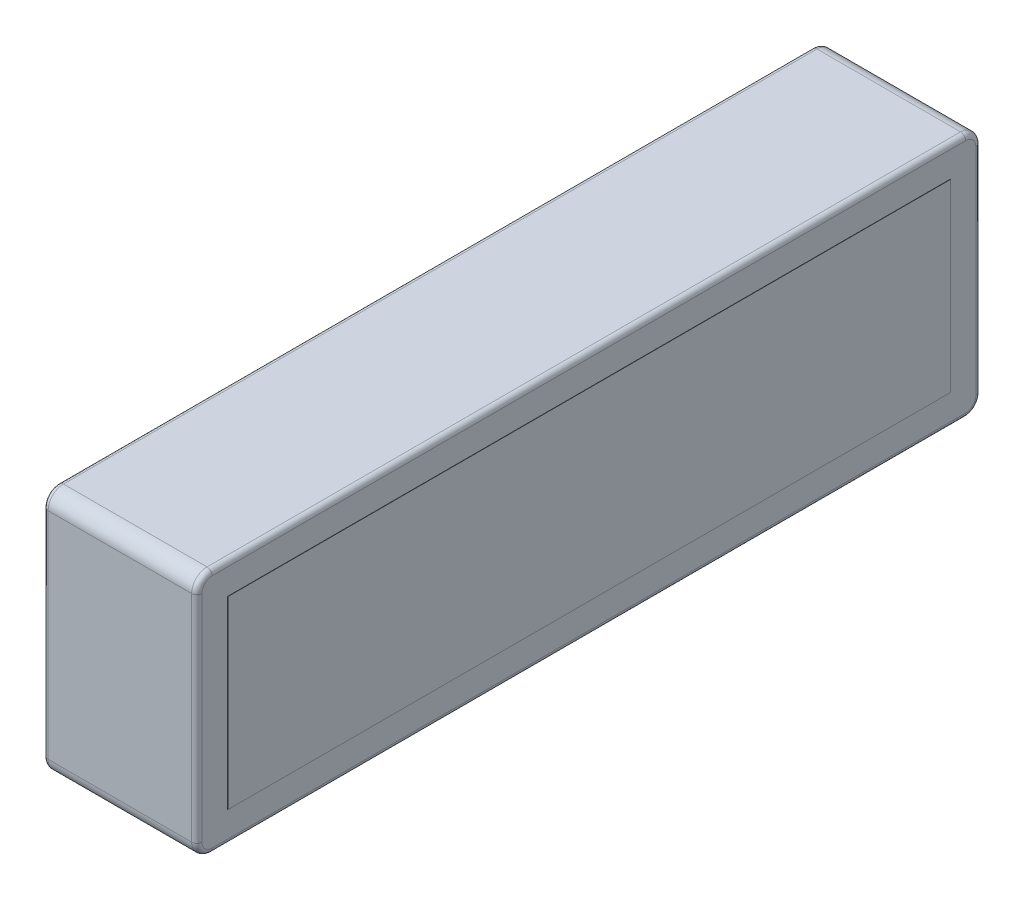
ISO-10303-21;
HEADER;
FILE_DESCRIPTION(('STEP AP214'),'2;1');
FILE_NAME('part.step','',(''),(''),'','','');
FILE_SCHEMA(('AUTOMOTIVE_DESIGN { 1 0 10303 214 1 1 1 1 }'));
ENDSEC;
DATA;
#1=APPLICATION_CONTEXT('core data for automotive mechanical design processes');
#2=APPLICATION_PROTOCOL_DEFINITION('international standard','automotive_design',2000,#1);
#3=PRODUCT_CONTEXT('',#1,'mechanical');
#4=PRODUCT('Part','Part','',(#3));
#5=PRODUCT_RELATED_PRODUCT_CATEGORY('part','',(#4));
#6=PRODUCT_DEFINITION_FORMATION('','',#4);
#7=PRODUCT_DEFINITION_CONTEXT('part definition',#1,'design');
#8=PRODUCT_DEFINITION('design','',#6,#7);
#9=PRODUCT_DEFINITION_SHAPE('','',#8);
#10=(LENGTH_UNIT() NAMED_UNIT(*) SI_UNIT(.MILLI.,.METRE.));
#11=(NAMED_UNIT(*) PLANE_ANGLE_UNIT() SI_UNIT($,.RADIAN.));
#12=(NAMED_UNIT(*) SI_UNIT($,.STERADIAN.) SOLID_ANGLE_UNIT());
#13=UNCERTAINTY_MEASURE_WITH_UNIT(LENGTH_MEASURE(1.E-05),#10,'distance_accuracy_value','');
#14=(GEOMETRIC_REPRESENTATION_CONTEXT(3) GLOBAL_UNCERTAINTY_ASSIGNED_CONTEXT((#13)) GLOBAL_UNIT_ASSIGNED_CONTEXT((#10,
#11,#12)) REPRESENTATION_CONTEXT('',''));
#15=CARTESIAN_POINT('',(0.,0.,0.));
#16=DIRECTION('',(0.,0.,1.));
#17=DIRECTION('',(1.,0.,0.));
#18=AXIS2_PLACEMENT_3D('',#15,#16,#17);
#19=CARTESIAN_POINT('',(-15.,24.,153.));
#20=DIRECTION('',(1.,0.,0.));
#21=DIRECTION('',(0.,1.,0.));
#22=AXIS2_PLACEMENT_3D('',#19,#20,#21);
#23=PLANE('',#22);
#24=DIRECTION('',(0.,-1.,0.));
#25=VECTOR('',#24,1.);
#26=CARTESIAN_POINT('',(-15.,24.,1.));
#27=LINE('',#26,#25);
#28=CARTESIAN_POINT('',(-15.,21.,1.));
#29=VERTEX_POINT('',#28);
#30=CARTESIAN_POINT('',(-15.,-21.,1.));
#31=VERTEX_POINT('',#30);
#32=EDGE_CURVE('E307',#29,#31,#27,.T.);
#33=ORIENTED_EDGE('',*,*,#32,.T.);
#34=CARTESIAN_POINT('',(-15.,-21.,3.));
#35=DIRECTION('',(1.,0.,0.));
#36=DIRECTION('',(0.,1.,0.));
#37=AXIS2_PLACEMENT_3D('',#34,#35,#36);
#38=CIRCLE('',#37,2.);
#39=CARTESIAN_POINT('',(-15.,-23.,3.));
#40=VERTEX_POINT('',#39);
#41=EDGE_CURVE('E309',#31,#40,#38,.F.);
#42=ORIENTED_EDGE('',*,*,#41,.T.);
#43=DIRECTION('',(0.,0.,-1.));
#44=VECTOR('',#43,1.);
#45=CARTESIAN_POINT('',(-15.,-23.,153.));
#46=LINE('',#45,#44);
#47=CARTESIAN_POINT('',(-15.,-23.,150.));
#48=VERTEX_POINT('',#47);
#49=EDGE_CURVE('E295',#40,#48,#46,.F.);
#50=ORIENTED_EDGE('',*,*,#49,.T.);
#51=CARTESIAN_POINT('',(-15.,-21.,150.));
#52=DIRECTION('',(1.,0.,0.));
#53=DIRECTION('',(0.,1.,0.));
#54=AXIS2_PLACEMENT_3D('',#51,#52,#53);
#55=CIRCLE('',#54,2.);
#56=CARTESIAN_POINT('',(-15.,-21.,152.));
#57=VERTEX_POINT('',#56);
#58=EDGE_CURVE('E297',#48,#57,#55,.F.);
#59=ORIENTED_EDGE('',*,*,#58,.T.);
#60=DIRECTION('',(0.,-1.,0.));
#61=VECTOR('',#60,1.);
#62=CARTESIAN_POINT('',(-15.,21.,152.));
#63=LINE('',#62,#61);
#64=CARTESIAN_POINT('',(-15.,21.,152.));
#65=VERTEX_POINT('',#64);
#66=EDGE_CURVE('E299',#57,#65,#63,.F.);
#67=ORIENTED_EDGE('',*,*,#66,.T.);
#68=CARTESIAN_POINT('',(-15.,21.,150.));
#69=DIRECTION('',(1.,0.,0.));
#70=DIRECTION('',(0.,1.,0.));
#71=AXIS2_PLACEMENT_3D('',#68,#69,#70);
#72=CIRCLE('',#71,2.);
#73=CARTESIAN_POINT('',(-15.,23.,150.));
#74=VERTEX_POINT('',#73);
#75=EDGE_CURVE('E301',#65,#74,#72,.F.);
#76=ORIENTED_EDGE('',*,*,#75,.T.);
#77=DIRECTION('',(0.,0.,-1.));
#78=VECTOR('',#77,1.);
#79=CARTESIAN_POINT('',(-15.,23.,153.));
#80=LINE('',#79,#78);
#81=CARTESIAN_POINT('',(-15.,23.,3.));
#82=VERTEX_POINT('',#81);
#83=EDGE_CURVE('E303',#74,#82,#80,.T.);
#84=ORIENTED_EDGE('',*,*,#83,.T.);
#85=CARTESIAN_POINT('',(-15.,21.,3.));
#86=DIRECTION('',(1.,0.,0.));
#87=DIRECTION('',(0.,1.,0.));
#88=AXIS2_PLACEMENT_3D('',#85,#86,#87);
#89=CIRCLE('',#88,2.);
#90=EDGE_CURVE('E305',#82,#29,#89,.F.);
#91=ORIENTED_EDGE('',*,*,#90,.T.);
#92=EDGE_LOOP('',(#33,#42,#50,#59,#67,#76,#84,#91));
#93=FACE_BOUND('',#92,.T.);
#94=DIRECTION('',(0.,0.,-1.));
#95=VECTOR('',#94,1.);
#96=CARTESIAN_POINT('',(-15.,18.,147.));
#97=LINE('',#96,#95);
#98=CARTESIAN_POINT('',(-15.,18.,147.));
#99=VERTEX_POINT('',#98);
#100=CARTESIAN_POINT('',(-15.,18.,6.00000000000001));
#101=VERTEX_POINT('',#100);
#102=EDGE_CURVE('E210',#99,#101,#97,.T.);
#103=ORIENTED_EDGE('',*,*,#102,.F.);
#104=DIRECTION('',(0.,1.,0.));
#105=VECTOR('',#104,1.);
#106=CARTESIAN_POINT('',(-15.,-18.,147.));
#107=LINE('',#106,#105);
#108=CARTESIAN_POINT('',(-15.,-18.,147.));
#109=VERTEX_POINT('',#108);
#110=EDGE_CURVE('E244',#109,#99,#107,.T.);
#111=ORIENTED_EDGE('',*,*,#110,.F.);
#112=DIRECTION('',(0.,0.,1.));
#113=VECTOR('',#112,1.);
#114=CARTESIAN_POINT('',(-15.,-18.,6.));
#115=LINE('',#114,#113);
#116=CARTESIAN_POINT('',(-15.,-18.,6.00000000000001));
#117=VERTEX_POINT('',#116);
#118=EDGE_CURVE('E254',#117,#109,#115,.T.);
#119=ORIENTED_EDGE('',*,*,#118,.F.);
#120=DIRECTION('',(0.,-1.,0.));
#121=VECTOR('',#120,1.);
#122=CARTESIAN_POINT('',(-15.,18.,6.));
#123=LINE('',#122,#121);
#124=EDGE_CURVE('E61',#101,#117,#123,.T.);
#125=ORIENTED_EDGE('',*,*,#124,.F.);
#126=EDGE_LOOP('',(#103,#111,#119,#125));
#127=FACE_BOUND('',#126,.T.);
#128=ADVANCED_FACE('F36',(#93,#127),#23,.F.);
#129=CARTESIAN_POINT('',(15.,24.,153.));
#130=DIRECTION('',(-1.,0.,0.));
#131=DIRECTION('',(0.,-1.,0.));
#132=AXIS2_PLACEMENT_3D('',#129,#130,#131);
#133=PLANE('',#132);
#134=DIRECTION('',(0.,1.,0.));
#135=VECTOR('',#134,1.);
#136=CARTESIAN_POINT('',(15.,-18.,147.));
#137=LINE('',#136,#135);
#138=CARTESIAN_POINT('',(15.,-18.,147.));
#139=VERTEX_POINT('',#138);
#140=CARTESIAN_POINT('',(15.,18.,147.));
#141=VERTEX_POINT('',#140);
#142=EDGE_CURVE('E231',#139,#141,#137,.T.);
#143=ORIENTED_EDGE('',*,*,#142,.T.);
#144=DIRECTION('',(0.,0.,-1.));
#145=VECTOR('',#144,1.);
#146=CARTESIAN_POINT('',(15.,18.,147.));
#147=LINE('',#146,#145);
#148=CARTESIAN_POINT('',(15.,18.,6.));
#149=VERTEX_POINT('',#148);
#150=EDGE_CURVE('E205',#141,#149,#147,.T.);
#151=ORIENTED_EDGE('',*,*,#150,.T.);
#152=DIRECTION('',(0.,-1.,0.));
#153=VECTOR('',#152,1.);
#154=CARTESIAN_POINT('',(15.,18.,6.));
#155=LINE('',#154,#153);
#156=CARTESIAN_POINT('',(15.,-18.,6.));
#157=VERTEX_POINT('',#156);
#158=EDGE_CURVE('E221',#149,#157,#155,.T.);
#159=ORIENTED_EDGE('',*,*,#158,.T.);
#160=DIRECTION('',(0.,0.,1.));
#161=VECTOR('',#160,1.);
#162=CARTESIAN_POINT('',(15.,-18.,6.));
#163=LINE('',#162,#161);
#164=EDGE_CURVE('E53',#157,#139,#163,.T.);
#165=ORIENTED_EDGE('',*,*,#164,.T.);
#166=EDGE_LOOP('',(#143,#151,#159,#165));
#167=FACE_BOUND('',#166,.T.);
#168=DIRECTION('',(0.,0.,-1.));
#169=VECTOR('',#168,1.);
#170=CARTESIAN_POINT('',(15.,23.,153.));
#171=LINE('',#170,#169);
#172=CARTESIAN_POINT('',(15.,23.,3.));
#173=VERTEX_POINT('',#172);
#174=CARTESIAN_POINT('',(15.,23.,150.));
#175=VERTEX_POINT('',#174);
#176=EDGE_CURVE('E45',#173,#175,#171,.F.);
#177=ORIENTED_EDGE('',*,*,#176,.T.);
#178=CARTESIAN_POINT('',(15.,21.,150.));
#179=DIRECTION('',(-1.,0.,0.));
#180=DIRECTION('',(0.,-1.,0.));
#181=AXIS2_PLACEMENT_3D('',#178,#179,#180);
#182=CIRCLE('',#181,2.);
#183=CARTESIAN_POINT('',(15.,21.,152.));
#184=VERTEX_POINT('',#183);
#185=EDGE_CURVE('E11',#175,#184,#182,.F.);
#186=ORIENTED_EDGE('',*,*,#185,.T.);
#187=DIRECTION('',(0.,1.,0.));
#188=VECTOR('',#187,1.);
#189=CARTESIAN_POINT('',(15.,-21.,152.));
#190=LINE('',#189,#188);
#191=CARTESIAN_POINT('',(15.,-21.,152.));
#192=VERTEX_POINT('',#191);
#193=EDGE_CURVE('E346',#184,#192,#190,.F.);
#194=ORIENTED_EDGE('',*,*,#193,.T.);
#195=CARTESIAN_POINT('',(15.,-21.,150.));
#196=DIRECTION('',(-1.,0.,0.));
#197=DIRECTION('',(0.,-1.,0.));
#198=AXIS2_PLACEMENT_3D('',#195,#196,#197);
#199=CIRCLE('',#198,2.);
#200=CARTESIAN_POINT('',(15.,-23.,150.));
#201=VERTEX_POINT('',#200);
#202=EDGE_CURVE('E348',#192,#201,#199,.F.);
#203=ORIENTED_EDGE('',*,*,#202,.T.);
#204=DIRECTION('',(0.,0.,-1.));
#205=VECTOR('',#204,1.);
#206=CARTESIAN_POINT('',(15.,-23.,153.));
#207=LINE('',#206,#205);
#208=CARTESIAN_POINT('',(15.,-23.,3.));
#209=VERTEX_POINT('',#208);
#210=EDGE_CURVE('E350',#201,#209,#207,.T.);
#211=ORIENTED_EDGE('',*,*,#210,.T.);
#212=CARTESIAN_POINT('',(15.,-21.,3.));
#213=DIRECTION('',(-1.,0.,0.));
#214=DIRECTION('',(0.,-1.,0.));
#215=AXIS2_PLACEMENT_3D('',#212,#213,#214);
#216=CIRCLE('',#215,2.);
#217=CARTESIAN_POINT('',(15.,-21.,1.));
#218=VERTEX_POINT('',#217);
#219=EDGE_CURVE('E352',#209,#218,#216,.F.);
#220=ORIENTED_EDGE('',*,*,#219,.T.);
#221=DIRECTION('',(0.,1.,0.));
#222=VECTOR('',#221,1.);
#223=CARTESIAN_POINT('',(15.,24.,1.));
#224=LINE('',#223,#222);
#225=CARTESIAN_POINT('',(15.,21.,1.));
#226=VERTEX_POINT('',#225);
#227=EDGE_CURVE('E354',#218,#226,#224,.T.);
#228=ORIENTED_EDGE('',*,*,#227,.T.);
#229=CARTESIAN_POINT('',(15.,21.,3.));
#230=DIRECTION('',(-1.,0.,0.));
#231=DIRECTION('',(0.,-1.,0.));
#232=AXIS2_PLACEMENT_3D('',#229,#230,#231);
#233=CIRCLE('',#232,2.);
#234=EDGE_CURVE('E356',#226,#173,#233,.F.);
#235=ORIENTED_EDGE('',*,*,#234,.T.);
#236=EDGE_LOOP('',(#177,#186,#194,#203,#211,#220,#228,#235));
#237=FACE_BOUND('',#236,.T.);
#238=ADVANCED_FACE('F498',(#167,#237),#133,.F.);
#239=CARTESIAN_POINT('',(-15.,24.,153.));
#240=DIRECTION('',(0.,-1.,0.));
#241=DIRECTION('',(0.,0.,-1.));
#242=AXIS2_PLACEMENT_3D('',#239,#240,#241);
#243=PLANE('',#242);
#244=DIRECTION('',(-1.,0.,0.));
#245=VECTOR('',#244,1.);
#246=CARTESIAN_POINT('',(-15.,24.,3.));
#247=LINE('',#246,#245);
#248=CARTESIAN_POINT('',(14.,24.,3.));
#249=VERTEX_POINT('',#248);
#250=CARTESIAN_POINT('',(-14.,24.,3.));
#251=VERTEX_POINT('',#250);
#252=EDGE_CURVE('E292',#249,#251,#247,.T.);
#253=ORIENTED_EDGE('',*,*,#252,.T.);
#254=DIRECTION('',(0.,0.,-1.));
#255=VECTOR('',#254,1.);
#256=CARTESIAN_POINT('',(-14.,24.,153.));
#257=LINE('',#256,#255);
#258=CARTESIAN_POINT('',(-14.,24.,150.));
#259=VERTEX_POINT('',#258);
#260=EDGE_CURVE('E327',#251,#259,#257,.F.);
#261=ORIENTED_EDGE('',*,*,#260,.T.);
#262=DIRECTION('',(-1.,0.,0.));
#263=VECTOR('',#262,1.);
#264=CARTESIAN_POINT('',(15.,24.,150.));
#265=LINE('',#264,#263);
#266=CARTESIAN_POINT('',(14.,24.,150.));
#267=VERTEX_POINT('',#266);
#268=EDGE_CURVE('E289',#259,#267,#265,.F.);
#269=ORIENTED_EDGE('',*,*,#268,.T.);
#270=DIRECTION('',(0.,0.,-1.));
#271=VECTOR('',#270,1.);
#272=CARTESIAN_POINT('',(14.,24.,153.));
#273=LINE('',#272,#271);
#274=EDGE_CURVE('E325',#267,#249,#273,.T.);
#275=ORIENTED_EDGE('',*,*,#274,.T.);
#276=EDGE_LOOP('',(#253,#261,#269,#275));
#277=FACE_BOUND('',#276,.T.);
#278=ADVANCED_FACE('F454',(#277),#243,.F.);
#279=CARTESIAN_POINT('',(-15.,-24.,153.));
#280=DIRECTION('',(0.,1.,0.));
#281=DIRECTION('',(0.,0.,1.));
#282=AXIS2_PLACEMENT_3D('',#279,#280,#281);
#283=PLANE('',#282);
#284=DIRECTION('',(1.,0.,0.));
#285=VECTOR('',#284,1.);
#286=CARTESIAN_POINT('',(-15.,-24.,150.));
#287=LINE('',#286,#285);
#288=CARTESIAN_POINT('',(14.,-24.,150.));
#289=VERTEX_POINT('',#288);
#290=CARTESIAN_POINT('',(-14.,-24.,150.));
#291=VERTEX_POINT('',#290);
#292=EDGE_CURVE('E280',#289,#291,#287,.F.);
#293=ORIENTED_EDGE('',*,*,#292,.T.);
#294=DIRECTION('',(0.,0.,-1.));
#295=VECTOR('',#294,1.);
#296=CARTESIAN_POINT('',(-14.,-24.,153.));
#297=LINE('',#296,#295);
#298=CARTESIAN_POINT('',(-14.,-24.,3.));
#299=VERTEX_POINT('',#298);
#300=EDGE_CURVE('E344',#291,#299,#297,.T.);
#301=ORIENTED_EDGE('',*,*,#300,.T.);
#302=DIRECTION('',(1.,0.,0.));
#303=VECTOR('',#302,1.);
#304=CARTESIAN_POINT('',(-15.,-24.,3.));
#305=LINE('',#304,#303);
#306=CARTESIAN_POINT('',(14.,-24.,3.));
#307=VERTEX_POINT('',#306);
#308=EDGE_CURVE('E277',#299,#307,#305,.T.);
#309=ORIENTED_EDGE('',*,*,#308,.T.);
#310=DIRECTION('',(0.,0.,-1.));
#311=VECTOR('',#310,1.);
#312=CARTESIAN_POINT('',(14.,-24.,153.));
#313=LINE('',#312,#311);
#314=EDGE_CURVE('E342',#307,#289,#313,.F.);
#315=ORIENTED_EDGE('',*,*,#314,.T.);
#316=EDGE_LOOP('',(#293,#301,#309,#315));
#317=FACE_BOUND('',#316,.T.);
#318=ADVANCED_FACE('F416',(#317),#283,.F.);
#319=CARTESIAN_POINT('',(0.,0.,153.));
#320=DIRECTION('',(0.,0.,1.));
#321=DIRECTION('',(1.,0.,0.));
#322=AXIS2_PLACEMENT_3D('',#319,#320,#321);
#323=PLANE('',#322);
#324=DIRECTION('',(-1.,0.,0.));
#325=VECTOR('',#324,1.);
#326=CARTESIAN_POINT('',(-15.,21.,153.));
#327=LINE('',#326,#325);
#328=CARTESIAN_POINT('',(14.,21.,153.));
#329=VERTEX_POINT('',#328);
#330=CARTESIAN_POINT('',(-14.,21.,153.));
#331=VERTEX_POINT('',#330);
#332=EDGE_CURVE('E270',#329,#331,#327,.T.);
#333=ORIENTED_EDGE('',*,*,#332,.T.);
#334=DIRECTION('',(0.,-1.,0.));
#335=VECTOR('',#334,1.);
#336=CARTESIAN_POINT('',(-14.,-21.,153.));
#337=LINE('',#336,#335);
#338=CARTESIAN_POINT('',(-14.,-21.,153.));
#339=VERTEX_POINT('',#338);
#340=EDGE_CURVE('E336',#331,#339,#337,.T.);
#341=ORIENTED_EDGE('',*,*,#340,.T.);
#342=DIRECTION('',(1.,0.,0.));
#343=VECTOR('',#342,1.);
#344=CARTESIAN_POINT('',(15.,-21.,153.));
#345=LINE('',#344,#343);
#346=CARTESIAN_POINT('',(14.,-21.,153.));
#347=VERTEX_POINT('',#346);
#348=EDGE_CURVE('E273',#339,#347,#345,.T.);
#349=ORIENTED_EDGE('',*,*,#348,.T.);
#350=DIRECTION('',(0.,1.,0.));
#351=VECTOR('',#350,1.);
#352=CARTESIAN_POINT('',(14.,21.,153.));
#353=LINE('',#352,#351);
#354=EDGE_CURVE('E334',#347,#329,#353,.T.);
#355=ORIENTED_EDGE('',*,*,#354,.T.);
#356=EDGE_LOOP('',(#333,#341,#349,#355));
#357=FACE_BOUND('',#356,.T.);
#358=ADVANCED_FACE('F471',(#357),#323,.T.);
#359=CARTESIAN_POINT('',(0.,0.,0.));
#360=DIRECTION('',(0.,0.,1.));
#361=DIRECTION('',(1.,0.,0.));
#362=AXIS2_PLACEMENT_3D('',#359,#360,#361);
#363=PLANE('',#362);
#364=DIRECTION('',(1.,0.,0.));
#365=VECTOR('',#364,1.);
#366=CARTESIAN_POINT('',(0.,-21.,0.));
#367=LINE('',#366,#365);
#368=CARTESIAN_POINT('',(14.,-21.,0.));
#369=VERTEX_POINT('',#368);
#370=CARTESIAN_POINT('',(-14.,-21.,0.));
#371=VERTEX_POINT('',#370);
#372=EDGE_CURVE('E286',#369,#371,#367,.F.);
#373=ORIENTED_EDGE('',*,*,#372,.T.);
#374=DIRECTION('',(0.,-1.,0.));
#375=VECTOR('',#374,1.);
#376=CARTESIAN_POINT('',(-14.,0.,0.));
#377=LINE('',#376,#375);
#378=CARTESIAN_POINT('',(-14.,21.,0.));
#379=VERTEX_POINT('',#378);
#380=EDGE_CURVE('E319',#371,#379,#377,.F.);
#381=ORIENTED_EDGE('',*,*,#380,.T.);
#382=DIRECTION('',(-1.,0.,0.));
#383=VECTOR('',#382,1.);
#384=CARTESIAN_POINT('',(0.,21.,0.));
#385=LINE('',#384,#383);
#386=CARTESIAN_POINT('',(14.,21.,0.));
#387=VERTEX_POINT('',#386);
#388=EDGE_CURVE('E283',#379,#387,#385,.F.);
#389=ORIENTED_EDGE('',*,*,#388,.T.);
#390=DIRECTION('',(0.,1.,0.));
#391=VECTOR('',#390,1.);
#392=CARTESIAN_POINT('',(14.,0.,0.));
#393=LINE('',#392,#391);
#394=EDGE_CURVE('E317',#387,#369,#393,.F.);
#395=ORIENTED_EDGE('',*,*,#394,.T.);
#396=EDGE_LOOP('',(#373,#381,#389,#395));
#397=FACE_BOUND('',#396,.T.);
#398=ADVANCED_FACE('F430',(#397),#363,.F.);
#399=CARTESIAN_POINT('',(0.,-21.,150.));
#400=DIRECTION('',(-1.,0.,0.));
#401=DIRECTION('',(0.,0.,1.));
#402=AXIS2_PLACEMENT_3D('',#399,#400,#401);
#403=CYLINDRICAL_SURFACE('',#402,3.);
#404=ORIENTED_EDGE('',*,*,#348,.F.);
#405=CARTESIAN_POINT('',(-14.,-21.,150.));
#406=DIRECTION('',(1.,0.,0.));
#407=DIRECTION('',(0.,1.,0.));
#408=AXIS2_PLACEMENT_3D('',#405,#406,#407);
#409=CIRCLE('',#408,3.);
#410=EDGE_CURVE('E340',#339,#291,#409,.T.);
#411=ORIENTED_EDGE('',*,*,#410,.T.);
#412=ORIENTED_EDGE('',*,*,#292,.F.);
#413=CARTESIAN_POINT('',(14.,-21.,150.));
#414=DIRECTION('',(-1.,0.,0.));
#415=DIRECTION('',(0.,-1.,0.));
#416=AXIS2_PLACEMENT_3D('',#413,#414,#415);
#417=CIRCLE('',#416,3.);
#418=EDGE_CURVE('E338',#289,#347,#417,.T.);
#419=ORIENTED_EDGE('',*,*,#418,.T.);
#420=EDGE_LOOP('',(#404,#411,#412,#419));
#421=FACE_BOUND('',#420,.T.);
#422=ADVANCED_FACE('F474',(#421),#403,.T.);
#423=CARTESIAN_POINT('',(-15.,-21.,3.));
#424=DIRECTION('',(1.,0.,0.));
#425=DIRECTION('',(0.,0.,-1.));
#426=AXIS2_PLACEMENT_3D('',#423,#424,#425);
#427=CYLINDRICAL_SURFACE('',#426,3.);
#428=ORIENTED_EDGE('',*,*,#308,.F.);
#429=CARTESIAN_POINT('',(-14.,-21.,3.));
#430=DIRECTION('',(1.,0.,0.));
#431=DIRECTION('',(0.,1.,0.));
#432=AXIS2_PLACEMENT_3D('',#429,#430,#431);
#433=CIRCLE('',#432,3.);
#434=EDGE_CURVE('E314',#299,#371,#433,.T.);
#435=ORIENTED_EDGE('',*,*,#434,.T.);
#436=ORIENTED_EDGE('',*,*,#372,.F.);
#437=CARTESIAN_POINT('',(14.,-21.,3.));
#438=DIRECTION('',(-1.,0.,0.));
#439=DIRECTION('',(0.,-1.,0.));
#440=AXIS2_PLACEMENT_3D('',#437,#438,#439);
#441=CIRCLE('',#440,3.);
#442=EDGE_CURVE('E312',#369,#307,#441,.T.);
#443=ORIENTED_EDGE('',*,*,#442,.T.);
#444=EDGE_LOOP('',(#428,#435,#436,#443));
#445=FACE_BOUND('',#444,.T.);
#446=ADVANCED_FACE('F413',(#445),#427,.T.);
#447=CARTESIAN_POINT('',(-15.,21.,3.));
#448=DIRECTION('',(-1.,0.,0.));
#449=DIRECTION('',(0.,0.,1.));
#450=AXIS2_PLACEMENT_3D('',#447,#448,#449);
#451=CYLINDRICAL_SURFACE('',#450,3.);
#452=ORIENTED_EDGE('',*,*,#388,.F.);
#453=CARTESIAN_POINT('',(-14.,21.,3.));
#454=DIRECTION('',(1.,0.,0.));
#455=DIRECTION('',(0.,1.,0.));
#456=AXIS2_PLACEMENT_3D('',#453,#454,#455);
#457=CIRCLE('',#456,3.);
#458=EDGE_CURVE('E323',#379,#251,#457,.T.);
#459=ORIENTED_EDGE('',*,*,#458,.T.);
#460=ORIENTED_EDGE('',*,*,#252,.F.);
#461=CARTESIAN_POINT('',(14.,21.,3.));
#462=DIRECTION('',(-1.,0.,0.));
#463=DIRECTION('',(0.,-1.,0.));
#464=AXIS2_PLACEMENT_3D('',#461,#462,#463);
#465=CIRCLE('',#464,3.);
#466=EDGE_CURVE('E321',#249,#387,#465,.T.);
#467=ORIENTED_EDGE('',*,*,#466,.T.);
#468=EDGE_LOOP('',(#452,#459,#460,#467));
#469=FACE_BOUND('',#468,.T.);
#470=ADVANCED_FACE('F434',(#469),#451,.T.);
#471=CARTESIAN_POINT('',(0.,21.,150.));
#472=DIRECTION('',(1.,0.,0.));
#473=DIRECTION('',(0.,0.,-1.));
#474=AXIS2_PLACEMENT_3D('',#471,#472,#473);
#475=CYLINDRICAL_SURFACE('',#474,3.);
#476=ORIENTED_EDGE('',*,*,#268,.F.);
#477=CARTESIAN_POINT('',(-14.,21.,150.));
#478=DIRECTION('',(1.,0.,0.));
#479=DIRECTION('',(0.,1.,0.));
#480=AXIS2_PLACEMENT_3D('',#477,#478,#479);
#481=CIRCLE('',#480,3.);
#482=EDGE_CURVE('E332',#259,#331,#481,.T.);
#483=ORIENTED_EDGE('',*,*,#482,.T.);
#484=ORIENTED_EDGE('',*,*,#332,.F.);
#485=CARTESIAN_POINT('',(14.,21.,150.));
#486=DIRECTION('',(-1.,0.,0.));
#487=DIRECTION('',(0.,-1.,0.));
#488=AXIS2_PLACEMENT_3D('',#485,#486,#487);
#489=CIRCLE('',#488,3.);
#490=EDGE_CURVE('E329',#329,#267,#489,.T.);
#491=ORIENTED_EDGE('',*,*,#490,.T.);
#492=EDGE_LOOP('',(#476,#483,#484,#491));
#493=FACE_BOUND('',#492,.T.);
#494=ADVANCED_FACE('F457',(#493),#475,.T.);
#495=CARTESIAN_POINT('',(-14.,21.,150.));
#496=DIRECTION('',(1.,0.,0.));
#497=DIRECTION('',(0.,1.,0.));
#498=AXIS2_PLACEMENT_3D('',#495,#496,#497);
#499=TOROIDAL_SURFACE('',#498,2.,1.);
#500=CARTESIAN_POINT('',(-14.,21.,152.));
#501=DIRECTION('',(0.,-1.,0.));
#502=DIRECTION('',(0.,0.,-1.));
#503=AXIS2_PLACEMENT_3D('',#500,#501,#502);
#504=CIRCLE('',#503,1.);
#505=EDGE_CURVE('E375',#331,#65,#504,.T.);
#506=ORIENTED_EDGE('',*,*,#505,.F.);
#507=ORIENTED_EDGE('',*,*,#482,.F.);
#508=CARTESIAN_POINT('',(-14.,23.,150.));
#509=DIRECTION('',(0.,0.,-1.));
#510=DIRECTION('',(-1.,0.,0.));
#511=AXIS2_PLACEMENT_3D('',#508,#509,#510);
#512=CIRCLE('',#511,1.);
#513=EDGE_CURVE('E274',#74,#259,#512,.T.);
#514=ORIENTED_EDGE('',*,*,#513,.F.);
#515=ORIENTED_EDGE('',*,*,#75,.F.);
#516=EDGE_LOOP('',(#506,#507,#514,#515));
#517=FACE_BOUND('',#516,.T.);
#518=ADVANCED_FACE('F462',(#517),#499,.T.);
#519=CARTESIAN_POINT('',(-14.,23.,153.));
#520=DIRECTION('',(0.,0.,-1.));
#521=DIRECTION('',(-1.,0.,0.));
#522=AXIS2_PLACEMENT_3D('',#519,#520,#521);
#523=CYLINDRICAL_SURFACE('',#522,1.);
#524=ORIENTED_EDGE('',*,*,#513,.T.);
#525=ORIENTED_EDGE('',*,*,#260,.F.);
#526=CARTESIAN_POINT('',(-14.,23.,3.));
#527=DIRECTION('',(0.,0.,-1.));
#528=DIRECTION('',(-1.,0.,0.));
#529=AXIS2_PLACEMENT_3D('',#526,#527,#528);
#530=CIRCLE('',#529,1.);
#531=EDGE_CURVE('E372',#82,#251,#530,.T.);
#532=ORIENTED_EDGE('',*,*,#531,.F.);
#533=ORIENTED_EDGE('',*,*,#83,.F.);
#534=EDGE_LOOP('',(#524,#525,#532,#533));
#535=FACE_BOUND('',#534,.T.);
#536=ADVANCED_FACE('F451',(#535),#523,.T.);
#537=CARTESIAN_POINT('',(-14.,0.,152.));
#538=DIRECTION('',(0.,1.,0.));
#539=DIRECTION('',(-1.,0.,0.));
#540=AXIS2_PLACEMENT_3D('',#537,#538,#539);
#541=CYLINDRICAL_SURFACE('',#540,1.);
#542=ORIENTED_EDGE('',*,*,#505,.T.);
#543=ORIENTED_EDGE('',*,*,#66,.F.);
#544=CARTESIAN_POINT('',(-14.,-21.,152.));
#545=DIRECTION('',(0.,-1.,0.));
#546=DIRECTION('',(0.,0.,-1.));
#547=AXIS2_PLACEMENT_3D('',#544,#545,#546);
#548=CIRCLE('',#547,1.);
#549=EDGE_CURVE('E369',#339,#57,#548,.T.);
#550=ORIENTED_EDGE('',*,*,#549,.F.);
#551=ORIENTED_EDGE('',*,*,#340,.F.);
#552=EDGE_LOOP('',(#542,#543,#550,#551));
#553=FACE_BOUND('',#552,.T.);
#554=ADVANCED_FACE('F467',(#553),#541,.T.);
#555=CARTESIAN_POINT('',(-14.,21.,3.));
#556=DIRECTION('',(1.,0.,0.));
#557=DIRECTION('',(0.,1.,0.));
#558=AXIS2_PLACEMENT_3D('',#555,#556,#557);
#559=TOROIDAL_SURFACE('',#558,2.,1.);
#560=ORIENTED_EDGE('',*,*,#531,.T.);
#561=ORIENTED_EDGE('',*,*,#458,.F.);
#562=CARTESIAN_POINT('',(-14.,21.,1.));
#563=DIRECTION('',(0.,-1.,0.));
#564=DIRECTION('',(0.,0.,-1.));
#565=AXIS2_PLACEMENT_3D('',#562,#563,#564);
#566=CIRCLE('',#565,1.);
#567=EDGE_CURVE('E366',#29,#379,#566,.T.);
#568=ORIENTED_EDGE('',*,*,#567,.F.);
#569=ORIENTED_EDGE('',*,*,#90,.F.);
#570=EDGE_LOOP('',(#560,#561,#568,#569));
#571=FACE_BOUND('',#570,.T.);
#572=ADVANCED_FACE('F439',(#571),#559,.T.);
#573=CARTESIAN_POINT('',(-14.,-21.,150.));
#574=DIRECTION('',(1.,0.,0.));
#575=DIRECTION('',(0.,1.,0.));
#576=AXIS2_PLACEMENT_3D('',#573,#574,#575);
#577=TOROIDAL_SURFACE('',#576,2.,1.);
#578=ORIENTED_EDGE('',*,*,#549,.T.);
#579=ORIENTED_EDGE('',*,*,#58,.F.);
#580=CARTESIAN_POINT('',(-14.,-23.,150.));
#581=DIRECTION('',(0.,0.,-1.));
#582=DIRECTION('',(-1.,0.,0.));
#583=AXIS2_PLACEMENT_3D('',#580,#581,#582);
#584=CIRCLE('',#583,1.);
#585=EDGE_CURVE('E363',#291,#48,#584,.T.);
#586=ORIENTED_EDGE('',*,*,#585,.F.);
#587=ORIENTED_EDGE('',*,*,#410,.F.);
#588=EDGE_LOOP('',(#578,#579,#586,#587));
#589=FACE_BOUND('',#588,.T.);
#590=ADVANCED_FACE('F533',(#589),#577,.T.);
#591=CARTESIAN_POINT('',(-14.,24.,1.));
#592=DIRECTION('',(0.,-1.,0.));
#593=DIRECTION('',(1.,0.,0.));
#594=AXIS2_PLACEMENT_3D('',#591,#592,#593);
#595=CYLINDRICAL_SURFACE('',#594,1.);
#596=ORIENTED_EDGE('',*,*,#567,.T.);
#597=ORIENTED_EDGE('',*,*,#380,.F.);
#598=CARTESIAN_POINT('',(-14.,-21.,1.));
#599=DIRECTION('',(0.,-1.,0.));
#600=DIRECTION('',(0.,0.,-1.));
#601=AXIS2_PLACEMENT_3D('',#598,#599,#600);
#602=CIRCLE('',#601,1.);
#603=EDGE_CURVE('E361',#31,#371,#602,.T.);
#604=ORIENTED_EDGE('',*,*,#603,.F.);
#605=ORIENTED_EDGE('',*,*,#32,.F.);
#606=EDGE_LOOP('',(#596,#597,#604,#605));
#607=FACE_BOUND('',#606,.T.);
#608=ADVANCED_FACE('F444',(#607),#595,.T.);
#609=CARTESIAN_POINT('',(-14.,-23.,153.));
#610=DIRECTION('',(0.,0.,-1.));
#611=DIRECTION('',(-1.,0.,0.));
#612=AXIS2_PLACEMENT_3D('',#609,#610,#611);
#613=CYLINDRICAL_SURFACE('',#612,1.);
#614=ORIENTED_EDGE('',*,*,#585,.T.);
#615=ORIENTED_EDGE('',*,*,#49,.F.);
#616=CARTESIAN_POINT('',(-14.,-23.,3.));
#617=DIRECTION('',(0.,0.,-1.));
#618=DIRECTION('',(-1.,0.,0.));
#619=AXIS2_PLACEMENT_3D('',#616,#617,#618);
#620=CIRCLE('',#619,1.);
#621=EDGE_CURVE('E359',#299,#40,#620,.T.);
#622=ORIENTED_EDGE('',*,*,#621,.F.);
#623=ORIENTED_EDGE('',*,*,#300,.F.);
#624=EDGE_LOOP('',(#614,#615,#622,#623));
#625=FACE_BOUND('',#624,.T.);
#626=ADVANCED_FACE('F422',(#625),#613,.T.);
#627=CARTESIAN_POINT('',(-14.,-21.,3.));
#628=DIRECTION('',(1.,0.,0.));
#629=DIRECTION('',(0.,1.,0.));
#630=AXIS2_PLACEMENT_3D('',#627,#628,#629);
#631=TOROIDAL_SURFACE('',#630,2.,1.);
#632=ORIENTED_EDGE('',*,*,#603,.T.);
#633=ORIENTED_EDGE('',*,*,#434,.F.);
#634=ORIENTED_EDGE('',*,*,#621,.T.);
#635=ORIENTED_EDGE('',*,*,#41,.F.);
#636=EDGE_LOOP('',(#632,#633,#634,#635));
#637=FACE_BOUND('',#636,.T.);
#638=ADVANCED_FACE('F426',(#637),#631,.T.);
#639=CARTESIAN_POINT('',(14.,-21.,3.));
#640=DIRECTION('',(-1.,0.,0.));
#641=DIRECTION('',(0.,-1.,0.));
#642=AXIS2_PLACEMENT_3D('',#639,#640,#641);
#643=TOROIDAL_SURFACE('',#642,2.,1.);
#644=CARTESIAN_POINT('',(14.,-23.,3.));
#645=DIRECTION('',(0.,0.,1.));
#646=DIRECTION('',(1.,0.,0.));
#647=AXIS2_PLACEMENT_3D('',#644,#645,#646);
#648=CIRCLE('',#647,1.);
#649=EDGE_CURVE('E394',#307,#209,#648,.T.);
#650=ORIENTED_EDGE('',*,*,#649,.F.);
#651=ORIENTED_EDGE('',*,*,#442,.F.);
#652=CARTESIAN_POINT('',(14.,-21.,1.));
#653=DIRECTION('',(0.,1.,0.));
#654=DIRECTION('',(0.,0.,1.));
#655=AXIS2_PLACEMENT_3D('',#652,#653,#654);
#656=CIRCLE('',#655,1.);
#657=EDGE_CURVE('E40',#218,#369,#656,.T.);
#658=ORIENTED_EDGE('',*,*,#657,.F.);
#659=ORIENTED_EDGE('',*,*,#219,.F.);
#660=EDGE_LOOP('',(#650,#651,#658,#659));
#661=FACE_BOUND('',#660,.T.);
#662=ADVANCED_FACE('F38',(#661),#643,.T.);
#663=CARTESIAN_POINT('',(14.,24.,1.));
#664=DIRECTION('',(0.,1.,0.));
#665=DIRECTION('',(-1.,0.,0.));
#666=AXIS2_PLACEMENT_3D('',#663,#664,#665);
#667=CYLINDRICAL_SURFACE('',#666,1.);
#668=ORIENTED_EDGE('',*,*,#657,.T.);
#669=ORIENTED_EDGE('',*,*,#394,.F.);
#670=CARTESIAN_POINT('',(14.,21.,1.));
#671=DIRECTION('',(0.,1.,0.));
#672=DIRECTION('',(0.,0.,1.));
#673=AXIS2_PLACEMENT_3D('',#670,#671,#672);
#674=CIRCLE('',#673,1.);
#675=EDGE_CURVE('E392',#226,#387,#674,.T.);
#676=ORIENTED_EDGE('',*,*,#675,.F.);
#677=ORIENTED_EDGE('',*,*,#227,.F.);
#678=EDGE_LOOP('',(#668,#669,#676,#677));
#679=FACE_BOUND('',#678,.T.);
#680=ADVANCED_FACE('F405',(#679),#667,.T.);
#681=CARTESIAN_POINT('',(14.,-23.,153.));
#682=DIRECTION('',(0.,0.,-1.));
#683=DIRECTION('',(-1.,0.,0.));
#684=AXIS2_PLACEMENT_3D('',#681,#682,#683);
#685=CYLINDRICAL_SURFACE('',#684,1.);
#686=ORIENTED_EDGE('',*,*,#649,.T.);
#687=ORIENTED_EDGE('',*,*,#210,.F.);
#688=CARTESIAN_POINT('',(14.,-23.,150.));
#689=DIRECTION('',(0.,0.,1.));
#690=DIRECTION('',(1.,0.,0.));
#691=AXIS2_PLACEMENT_3D('',#688,#689,#690);
#692=CIRCLE('',#691,1.);
#693=EDGE_CURVE('E389',#289,#201,#692,.T.);
#694=ORIENTED_EDGE('',*,*,#693,.F.);
#695=ORIENTED_EDGE('',*,*,#314,.F.);
#696=EDGE_LOOP('',(#686,#687,#694,#695));
#697=FACE_BOUND('',#696,.T.);
#698=ADVANCED_FACE('F499',(#697),#685,.T.);
#699=CARTESIAN_POINT('',(14.,21.,3.));
#700=DIRECTION('',(-1.,0.,0.));
#701=DIRECTION('',(0.,-1.,0.));
#702=AXIS2_PLACEMENT_3D('',#699,#700,#701);
#703=TOROIDAL_SURFACE('',#702,2.,1.);
#704=ORIENTED_EDGE('',*,*,#675,.T.);
#705=ORIENTED_EDGE('',*,*,#466,.F.);
#706=CARTESIAN_POINT('',(14.,23.,3.));
#707=DIRECTION('',(0.,0.,1.));
#708=DIRECTION('',(1.,0.,0.));
#709=AXIS2_PLACEMENT_3D('',#706,#707,#708);
#710=CIRCLE('',#709,1.);
#711=EDGE_CURVE('E386',#173,#249,#710,.T.);
#712=ORIENTED_EDGE('',*,*,#711,.F.);
#713=ORIENTED_EDGE('',*,*,#234,.F.);
#714=EDGE_LOOP('',(#704,#705,#712,#713));
#715=FACE_BOUND('',#714,.T.);
#716=ADVANCED_FACE('F495',(#715),#703,.T.);
#717=CARTESIAN_POINT('',(14.,-21.,150.));
#718=DIRECTION('',(-1.,0.,0.));
#719=DIRECTION('',(0.,-1.,0.));
#720=AXIS2_PLACEMENT_3D('',#717,#718,#719);
#721=TOROIDAL_SURFACE('',#720,2.,1.);
#722=ORIENTED_EDGE('',*,*,#693,.T.);
#723=ORIENTED_EDGE('',*,*,#202,.F.);
#724=CARTESIAN_POINT('',(14.,-21.,152.));
#725=DIRECTION('',(0.,1.,0.));
#726=DIRECTION('',(0.,0.,1.));
#727=AXIS2_PLACEMENT_3D('',#724,#725,#726);
#728=CIRCLE('',#727,1.);
#729=EDGE_CURVE('E383',#347,#192,#728,.T.);
#730=ORIENTED_EDGE('',*,*,#729,.F.);
#731=ORIENTED_EDGE('',*,*,#418,.F.);
#732=EDGE_LOOP('',(#722,#723,#730,#731));
#733=FACE_BOUND('',#732,.T.);
#734=ADVANCED_FACE('F478',(#733),#721,.T.);
#735=CARTESIAN_POINT('',(14.,23.,153.));
#736=DIRECTION('',(0.,0.,-1.));
#737=DIRECTION('',(-1.,0.,0.));
#738=AXIS2_PLACEMENT_3D('',#735,#736,#737);
#739=CYLINDRICAL_SURFACE('',#738,1.);
#740=ORIENTED_EDGE('',*,*,#711,.T.);
#741=ORIENTED_EDGE('',*,*,#274,.F.);
#742=CARTESIAN_POINT('',(14.,23.,150.));
#743=DIRECTION('',(0.,0.,1.));
#744=DIRECTION('',(1.,0.,0.));
#745=AXIS2_PLACEMENT_3D('',#742,#743,#744);
#746=CIRCLE('',#745,1.);
#747=EDGE_CURVE('E381',#175,#267,#746,.T.);
#748=ORIENTED_EDGE('',*,*,#747,.F.);
#749=ORIENTED_EDGE('',*,*,#176,.F.);
#750=EDGE_LOOP('',(#740,#741,#748,#749));
#751=FACE_BOUND('',#750,.T.);
#752=ADVANCED_FACE('F492',(#751),#739,.T.);
#753=CARTESIAN_POINT('',(14.,0.,152.));
#754=DIRECTION('',(0.,-1.,0.));
#755=DIRECTION('',(1.,0.,0.));
#756=AXIS2_PLACEMENT_3D('',#753,#754,#755);
#757=CYLINDRICAL_SURFACE('',#756,1.);
#758=ORIENTED_EDGE('',*,*,#729,.T.);
#759=ORIENTED_EDGE('',*,*,#193,.F.);
#760=CARTESIAN_POINT('',(14.,21.,152.));
#761=DIRECTION('',(0.,1.,0.));
#762=DIRECTION('',(0.,0.,1.));
#763=AXIS2_PLACEMENT_3D('',#760,#761,#762);
#764=CIRCLE('',#763,1.);
#765=EDGE_CURVE('E269',#329,#184,#764,.T.);
#766=ORIENTED_EDGE('',*,*,#765,.F.);
#767=ORIENTED_EDGE('',*,*,#354,.F.);
#768=EDGE_LOOP('',(#758,#759,#766,#767));
#769=FACE_BOUND('',#768,.T.);
#770=ADVANCED_FACE('F484',(#769),#757,.T.);
#771=CARTESIAN_POINT('',(14.,21.,150.));
#772=DIRECTION('',(-1.,0.,0.));
#773=DIRECTION('',(0.,-1.,0.));
#774=AXIS2_PLACEMENT_3D('',#771,#772,#773);
#775=TOROIDAL_SURFACE('',#774,2.,1.);
#776=ORIENTED_EDGE('',*,*,#747,.T.);
#777=ORIENTED_EDGE('',*,*,#490,.F.);
#778=ORIENTED_EDGE('',*,*,#765,.T.);
#779=ORIENTED_EDGE('',*,*,#185,.F.);
#780=EDGE_LOOP('',(#776,#777,#778,#779));
#781=FACE_BOUND('',#780,.T.);
#782=ADVANCED_FACE('F486',(#781),#775,.T.);
#783=CARTESIAN_POINT('',(-15.05,18.,147.));
#784=DIRECTION('',(0.,-1.,0.));
#785=DIRECTION('',(1.,0.,0.));
#786=AXIS2_PLACEMENT_3D('',#783,#784,#785);
#787=PLANE('',#786);
#788=ORIENTED_EDGE('',*,*,#102,.T.);
#789=DIRECTION('',(1.,0.,0.));
#790=VECTOR('',#789,1.);
#791=CARTESIAN_POINT('',(-15.05,18.,6.));
#792=LINE('',#791,#790);
#793=CARTESIAN_POINT('',(-15.05,18.,6.));
#794=VERTEX_POINT('',#793);
#795=EDGE_CURVE('E267',#794,#101,#792,.T.);
#796=ORIENTED_EDGE('',*,*,#795,.F.);
#797=DIRECTION('',(0.,0.,-1.));
#798=VECTOR('',#797,1.);
#799=CARTESIAN_POINT('',(-15.05,18.,147.));
#800=LINE('',#799,#798);
#801=CARTESIAN_POINT('',(-15.05,18.,147.));
#802=VERTEX_POINT('',#801);
#803=EDGE_CURVE('E240',#802,#794,#800,.T.);
#804=ORIENTED_EDGE('',*,*,#803,.F.);
#805=DIRECTION('',(1.,0.,0.));
#806=VECTOR('',#805,1.);
#807=CARTESIAN_POINT('',(-15.05,18.,147.));
#808=LINE('',#807,#806);
#809=EDGE_CURVE('E250',#802,#99,#808,.T.);
#810=ORIENTED_EDGE('',*,*,#809,.T.);
#811=EDGE_LOOP('',(#788,#796,#804,#810));
#812=FACE_BOUND('',#811,.T.);
#813=ADVANCED_FACE('F547',(#812),#787,.F.);
#814=CARTESIAN_POINT('',(-15.05,18.,6.));
#815=DIRECTION('',(0.,0.,1.));
#816=DIRECTION('',(0.,-1.,0.));
#817=AXIS2_PLACEMENT_3D('',#814,#815,#816);
#818=PLANE('',#817);
#819=ORIENTED_EDGE('',*,*,#124,.T.);
#820=DIRECTION('',(1.,0.,0.));
#821=VECTOR('',#820,1.);
#822=CARTESIAN_POINT('',(-15.05,-18.,6.));
#823=LINE('',#822,#821);
#824=CARTESIAN_POINT('',(-15.05,-18.,6.));
#825=VERTEX_POINT('',#824);
#826=EDGE_CURVE('E264',#825,#117,#823,.T.);
#827=ORIENTED_EDGE('',*,*,#826,.F.);
#828=DIRECTION('',(0.,-1.,0.));
#829=VECTOR('',#828,1.);
#830=CARTESIAN_POINT('',(-15.05,18.,6.));
#831=LINE('',#830,#829);
#832=EDGE_CURVE('E243',#794,#825,#831,.T.);
#833=ORIENTED_EDGE('',*,*,#832,.F.);
#834=ORIENTED_EDGE('',*,*,#795,.T.);
#835=EDGE_LOOP('',(#819,#827,#833,#834));
#836=FACE_BOUND('',#835,.T.);
#837=ADVANCED_FACE('F575',(#836),#818,.F.);
#838=CARTESIAN_POINT('',(-15.05,-18.,6.));
#839=DIRECTION('',(0.,1.,0.));
#840=DIRECTION('',(-1.,0.,0.));
#841=AXIS2_PLACEMENT_3D('',#838,#839,#840);
#842=PLANE('',#841);
#843=ORIENTED_EDGE('',*,*,#118,.T.);
#844=DIRECTION('',(1.,0.,0.));
#845=VECTOR('',#844,1.);
#846=CARTESIAN_POINT('',(-15.05,-18.,147.));
#847=LINE('',#846,#845);
#848=CARTESIAN_POINT('',(-15.05,-18.,147.));
#849=VERTEX_POINT('',#848);
#850=EDGE_CURVE('E261',#849,#109,#847,.T.);
#851=ORIENTED_EDGE('',*,*,#850,.F.);
#852=DIRECTION('',(0.,0.,1.));
#853=VECTOR('',#852,1.);
#854=CARTESIAN_POINT('',(-15.05,-18.,6.));
#855=LINE('',#854,#853);
#856=EDGE_CURVE('E246',#825,#849,#855,.T.);
#857=ORIENTED_EDGE('',*,*,#856,.F.);
#858=ORIENTED_EDGE('',*,*,#826,.T.);
#859=EDGE_LOOP('',(#843,#851,#857,#858));
#860=FACE_BOUND('',#859,.T.);
#861=ADVANCED_FACE('F583',(#860),#842,.F.);
#862=CARTESIAN_POINT('',(-15.05,-18.,147.));
#863=DIRECTION('',(0.,0.,-1.));
#864=DIRECTION('',(-1.,0.,0.));
#865=AXIS2_PLACEMENT_3D('',#862,#863,#864);
#866=PLANE('',#865);
#867=ORIENTED_EDGE('',*,*,#110,.T.);
#868=ORIENTED_EDGE('',*,*,#809,.F.);
#869=DIRECTION('',(0.,1.,0.));
#870=VECTOR('',#869,1.);
#871=CARTESIAN_POINT('',(-15.05,-18.,147.));
#872=LINE('',#871,#870);
#873=EDGE_CURVE('E248',#849,#802,#872,.T.);
#874=ORIENTED_EDGE('',*,*,#873,.F.);
#875=ORIENTED_EDGE('',*,*,#850,.T.);
#876=EDGE_LOOP('',(#867,#868,#874,#875));
#877=FACE_BOUND('',#876,.T.);
#878=ADVANCED_FACE('F591',(#877),#866,.F.);
#879=CARTESIAN_POINT('',(-15.05,0.,0.));
#880=DIRECTION('',(-1.,0.,0.));
#881=DIRECTION('',(0.,-1.,0.));
#882=AXIS2_PLACEMENT_3D('',#879,#880,#881);
#883=PLANE('',#882);
#884=ORIENTED_EDGE('',*,*,#803,.T.);
#885=ORIENTED_EDGE('',*,*,#832,.T.);
#886=ORIENTED_EDGE('',*,*,#856,.T.);
#887=ORIENTED_EDGE('',*,*,#873,.T.);
#888=EDGE_LOOP('',(#884,#885,#886,#887));
#889=FACE_BOUND('',#888,.T.);
#890=ADVANCED_FACE('F599',(#889),#883,.T.);
#891=CARTESIAN_POINT('',(15.05,18.,147.));
#892=DIRECTION('',(0.,1.,0.));
#893=DIRECTION('',(-1.,0.,0.));
#894=AXIS2_PLACEMENT_3D('',#891,#892,#893);
#895=PLANE('',#894);
#896=ORIENTED_EDGE('',*,*,#150,.F.);
#897=DIRECTION('',(-1.,0.,0.));
#898=VECTOR('',#897,1.);
#899=CARTESIAN_POINT('',(15.05,18.,147.));
#900=LINE('',#899,#898);
#901=CARTESIAN_POINT('',(15.05,18.,147.));
#902=VERTEX_POINT('',#901);
#903=EDGE_CURVE('E199',#902,#141,#900,.T.);
#904=ORIENTED_EDGE('',*,*,#903,.F.);
#905=DIRECTION('',(0.,0.,-1.));
#906=VECTOR('',#905,1.);
#907=CARTESIAN_POINT('',(15.05,18.,147.));
#908=LINE('',#907,#906);
#909=CARTESIAN_POINT('',(15.05,18.,6.));
#910=VERTEX_POINT('',#909);
#911=EDGE_CURVE('E202',#902,#910,#908,.T.);
#912=ORIENTED_EDGE('',*,*,#911,.T.);
#913=DIRECTION('',(-1.,0.,0.));
#914=VECTOR('',#913,1.);
#915=CARTESIAN_POINT('',(15.05,18.,6.));
#916=LINE('',#915,#914);
#917=EDGE_CURVE('E229',#910,#149,#916,.T.);
#918=ORIENTED_EDGE('',*,*,#917,.T.);
#919=EDGE_LOOP('',(#896,#904,#912,#918));
#920=FACE_BOUND('',#919,.T.);
#921=ADVANCED_FACE('F201',(#920),#895,.T.);
#922=CARTESIAN_POINT('',(15.05,-18.,147.));
#923=DIRECTION('',(0.,0.,1.));
#924=DIRECTION('',(1.,0.,0.));
#925=AXIS2_PLACEMENT_3D('',#922,#923,#924);
#926=PLANE('',#925);
#927=ORIENTED_EDGE('',*,*,#142,.F.);
#928=DIRECTION('',(-1.,0.,0.));
#929=VECTOR('',#928,1.);
#930=CARTESIAN_POINT('',(15.05,-18.,147.));
#931=LINE('',#930,#929);
#932=CARTESIAN_POINT('',(15.05,-18.,147.));
#933=VERTEX_POINT('',#932);
#934=EDGE_CURVE('E211',#933,#139,#931,.T.);
#935=ORIENTED_EDGE('',*,*,#934,.F.);
#936=DIRECTION('',(0.,1.,0.));
#937=VECTOR('',#936,1.);
#938=CARTESIAN_POINT('',(15.05,-18.,147.));
#939=LINE('',#938,#937);
#940=EDGE_CURVE('E217',#933,#902,#939,.T.);
#941=ORIENTED_EDGE('',*,*,#940,.T.);
#942=ORIENTED_EDGE('',*,*,#903,.T.);
#943=EDGE_LOOP('',(#927,#935,#941,#942));
#944=FACE_BOUND('',#943,.T.);
#945=ADVANCED_FACE('F223',(#944),#926,.T.);
#946=CARTESIAN_POINT('',(15.05,-18.,6.));
#947=DIRECTION('',(0.,-1.,0.));
#948=DIRECTION('',(1.,0.,0.));
#949=AXIS2_PLACEMENT_3D('',#946,#947,#948);
#950=PLANE('',#949);
#951=ORIENTED_EDGE('',*,*,#164,.F.);
#952=DIRECTION('',(-1.,0.,0.));
#953=VECTOR('',#952,1.);
#954=CARTESIAN_POINT('',(15.05,-18.,6.));
#955=LINE('',#954,#953);
#956=CARTESIAN_POINT('',(15.05,-18.,6.));
#957=VERTEX_POINT('',#956);
#958=EDGE_CURVE('E237',#957,#157,#955,.T.);
#959=ORIENTED_EDGE('',*,*,#958,.F.);
#960=DIRECTION('',(0.,0.,1.));
#961=VECTOR('',#960,1.);
#962=CARTESIAN_POINT('',(15.05,-18.,6.));
#963=LINE('',#962,#961);
#964=EDGE_CURVE('E224',#957,#933,#963,.T.);
#965=ORIENTED_EDGE('',*,*,#964,.T.);
#966=ORIENTED_EDGE('',*,*,#934,.T.);
#967=EDGE_LOOP('',(#951,#959,#965,#966));
#968=FACE_BOUND('',#967,.T.);
#969=ADVANCED_FACE('F620',(#968),#950,.T.);
#970=CARTESIAN_POINT('',(15.05,18.,6.));
#971=DIRECTION('',(0.,0.,-1.));
#972=DIRECTION('',(0.,1.,0.));
#973=AXIS2_PLACEMENT_3D('',#970,#971,#972);
#974=PLANE('',#973);
#975=ORIENTED_EDGE('',*,*,#158,.F.);
#976=ORIENTED_EDGE('',*,*,#917,.F.);
#977=DIRECTION('',(0.,-1.,0.));
#978=VECTOR('',#977,1.);
#979=CARTESIAN_POINT('',(15.05,18.,6.));
#980=LINE('',#979,#978);
#981=EDGE_CURVE('E220',#910,#957,#980,.T.);
#982=ORIENTED_EDGE('',*,*,#981,.T.);
#983=ORIENTED_EDGE('',*,*,#958,.T.);
#984=EDGE_LOOP('',(#975,#976,#982,#983));
#985=FACE_BOUND('',#984,.T.);
#986=ADVANCED_FACE('F627',(#985),#974,.T.);
#987=CARTESIAN_POINT('',(15.05,0.,0.));
#988=DIRECTION('',(1.,0.,0.));
#989=DIRECTION('',(0.,-1.,0.));
#990=AXIS2_PLACEMENT_3D('',#987,#988,#989);
#991=PLANE('',#990);
#992=ORIENTED_EDGE('',*,*,#911,.F.);
#993=ORIENTED_EDGE('',*,*,#940,.F.);
#994=ORIENTED_EDGE('',*,*,#964,.F.);
#995=ORIENTED_EDGE('',*,*,#981,.F.);
#996=EDGE_LOOP('',(#992,#993,#994,#995));
#997=FACE_BOUND('',#996,.T.);
#998=ADVANCED_FACE('F215',(#997),#991,.T.);
#999=CLOSED_SHELL('',(#128,#238,#278,#318,#358,#398,#422,#446,#470,#494,#518,#536,#554,#572,
#590,#608,#626,#638,#662,#680,#698,#716,#734,#752,#770,#782,#813,#837,#861,#878,#890,#921,#945,
#969,#986,#998));
#1000=MANIFOLD_SOLID_BREP('B2',#999);
#1001=ADVANCED_BREP_SHAPE_REPRESENTATION('',(#18,#1000),#14);
#1002=SHAPE_DEFINITION_REPRESENTATION(#9,#1001);
ENDSEC;
END-ISO-10303-21;
